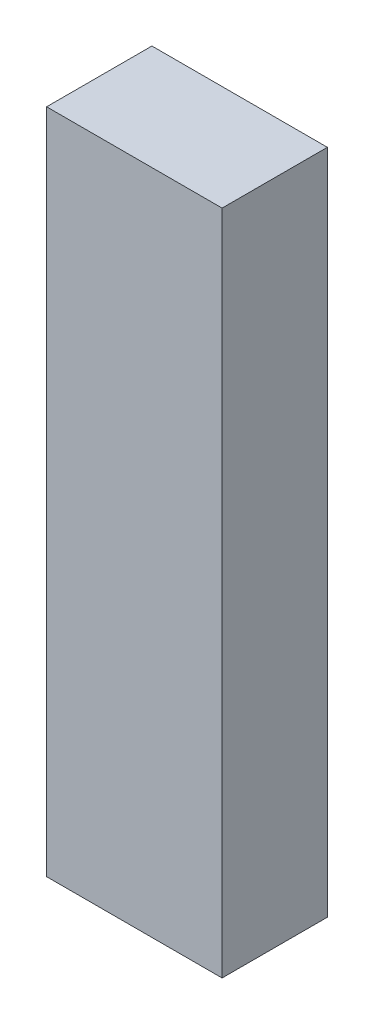
ISO-10303-21;
HEADER;
FILE_DESCRIPTION(('STEP AP214'),'2;1');
FILE_NAME('part.step','',(''),(''),'','','');
FILE_SCHEMA(('AUTOMOTIVE_DESIGN { 1 0 10303 214 1 1 1 1 }'));
ENDSEC;
DATA;
#1=APPLICATION_CONTEXT('core data for automotive mechanical design processes');
#2=APPLICATION_PROTOCOL_DEFINITION('international standard','automotive_design',2000,#1);
#3=PRODUCT_CONTEXT('',#1,'mechanical');
#4=PRODUCT('Part','Part','',(#3));
#5=PRODUCT_RELATED_PRODUCT_CATEGORY('part','',(#4));
#6=PRODUCT_DEFINITION_FORMATION('','',#4);
#7=PRODUCT_DEFINITION_CONTEXT('part definition',#1,'design');
#8=PRODUCT_DEFINITION('design','',#6,#7);
#9=PRODUCT_DEFINITION_SHAPE('','',#8);
#10=(LENGTH_UNIT() NAMED_UNIT(*) SI_UNIT(.MILLI.,.METRE.));
#11=(NAMED_UNIT(*) PLANE_ANGLE_UNIT() SI_UNIT($,.RADIAN.));
#12=(NAMED_UNIT(*) SI_UNIT($,.STERADIAN.) SOLID_ANGLE_UNIT());
#13=UNCERTAINTY_MEASURE_WITH_UNIT(LENGTH_MEASURE(1.E-05),#10,'distance_accuracy_value','');
#14=(GEOMETRIC_REPRESENTATION_CONTEXT(3) GLOBAL_UNCERTAINTY_ASSIGNED_CONTEXT((#13)) GLOBAL_UNIT_ASSIGNED_CONTEXT((#10,
#11,#12)) REPRESENTATION_CONTEXT('',''));
#15=CARTESIAN_POINT('',(0.,0.,0.));
#16=DIRECTION('',(0.,0.,1.));
#17=DIRECTION('',(1.,0.,0.));
#18=AXIS2_PLACEMENT_3D('',#15,#16,#17);
#19=CARTESIAN_POINT('',(0.497199057448997,15.6759708048161,-0.759999162582823));
#20=CARTESIAN_POINT('',(0.497199057448997,15.6759707418717,-0.0399991625828247));
#21=CARTESIAN_POINT('',(0.497199111826453,20.235970804816,-0.759998763935156));
#22=CARTESIAN_POINT('',(0.497199111826453,20.2359707418716,-0.039998763935158));
#23=(BOUNDED_SURFACE() B_SPLINE_SURFACE(1,1,((#19,#20),(#21,#22)),.UNSPECIFIED.,.F.,.F.,
.F.) B_SPLINE_SURFACE_WITH_KNOTS((2,2),(2,2),(-0.000380000000000037,0.00417999999999991),
(-0.00066,6.E-05),.UNSPECIFIED.) GEOMETRIC_REPRESENTATION_ITEM() RATIONAL_B_SPLINE_SURFACE(((1.,
1.),(1.,1.))) REPRESENTATION_ITEM('') SURFACE());
#24=CARTESIAN_POINT('',(0.497199061980452,16.0559707471171,-0.0999991293621858));
#25=CARTESIAN_POINT('',(0.497199061980452,16.0559707995707,-0.699999129362184));
#26=(BOUNDED_CURVE() B_SPLINE_CURVE(1,(#24,#25),.UNSPECIFIED.,.F.,
.F.) B_SPLINE_CURVE_WITH_KNOTS((2,2),(0.,0.0006),
.UNSPECIFIED.) CURVE() GEOMETRIC_REPRESENTATION_ITEM() RATIONAL_B_SPLINE_CURVE((1.,1.)) REPRESENTATION_ITEM(''));
#27=CARTESIAN_POINT('',(0.497199061980452,16.0559707471171,-0.0999991293621858));
#28=VERTEX_POINT('',#27);
#29=CARTESIAN_POINT('',(0.497199061980452,16.0559707995707,-0.699999129362184));
#30=VERTEX_POINT('',#29);
#31=EDGE_CURVE('E23',#28,#30,#26,.T.);
#32=CARTESIAN_POINT('',(0.497199061980452,16.0559707995707,-0.699999129362184));
#33=CARTESIAN_POINT('',(0.497199107294998,19.8559707995706,-0.699998797155795));
#34=(BOUNDED_CURVE() B_SPLINE_CURVE(1,(#32,#33),.UNSPECIFIED.,.F.,
.F.) B_SPLINE_CURVE_WITH_KNOTS((2,2),(0.,0.0037999999999999),
.UNSPECIFIED.) CURVE() GEOMETRIC_REPRESENTATION_ITEM() RATIONAL_B_SPLINE_CURVE((1.,1.)) REPRESENTATION_ITEM(''));
#35=CARTESIAN_POINT('',(0.497199107294982,19.8559707995706,-0.699998797155795));
#36=VERTEX_POINT('',#35);
#37=EDGE_CURVE('E66',#30,#36,#34,.T.);
#38=CARTESIAN_POINT('',(0.497199107294982,19.855970747117,-0.0999987971557967));
#39=CARTESIAN_POINT('',(0.497199107294982,19.8559707995706,-0.699998797155795));
#40=(BOUNDED_CURVE() B_SPLINE_CURVE(1,(#38,#39),.UNSPECIFIED.,.F.,
.F.) B_SPLINE_CURVE_WITH_KNOTS((2,2),(0.,0.0006),
.UNSPECIFIED.) CURVE() GEOMETRIC_REPRESENTATION_ITEM() RATIONAL_B_SPLINE_CURVE((1.,1.)) REPRESENTATION_ITEM(''));
#41=CARTESIAN_POINT('',(0.497199107294982,19.855970747117,-0.0999987971557967));
#42=VERTEX_POINT('',#41);
#43=EDGE_CURVE('E11',#42,#36,#40,.T.);
#44=CARTESIAN_POINT('',(0.497199061980452,16.0559707471171,-0.0999991293621858));
#45=CARTESIAN_POINT('',(0.497199107294998,19.855970747117,-0.0999987971557968));
#46=(BOUNDED_CURVE() B_SPLINE_CURVE(1,(#44,#45),.UNSPECIFIED.,.F.,
.F.) B_SPLINE_CURVE_WITH_KNOTS((2,2),(0.,0.0037999999999999),
.UNSPECIFIED.) CURVE() GEOMETRIC_REPRESENTATION_ITEM() RATIONAL_B_SPLINE_CURVE((1.,1.)) REPRESENTATION_ITEM(''));
#47=EDGE_CURVE('E64',#28,#42,#46,.T.);
#48=ORIENTED_EDGE('',*,*,#31,.T.);
#49=ORIENTED_EDGE('',*,*,#37,.T.);
#50=ORIENTED_EDGE('',*,*,#43,.F.);
#51=ORIENTED_EDGE('',*,*,#47,.F.);
#52=EDGE_LOOP('',(#48,#49,#50,#51));
#53=FACE_BOUND('',#52,.T.);
#54=ADVANCED_FACE('F17',(#53),#23,.T.);
#55=CARTESIAN_POINT('',(0.597199107294982,19.8559708036235,-0.759998797155795));
#56=CARTESIAN_POINT('',(0.597199107294982,19.8559707406791,-0.039998797155797));
#57=CARTESIAN_POINT('',(-0.602800892705019,19.8559708179334,-0.759998797155794));
#58=CARTESIAN_POINT('',(-0.602800892705019,19.855970754989,-0.0399987971557957));
#59=(BOUNDED_SURFACE() B_SPLINE_SURFACE(1,1,((#55,#56),(#57,#58)),.UNSPECIFIED.,.F.,.F.,
.F.) B_SPLINE_SURFACE_WITH_KNOTS((2,2),(2,2),(-0.0001,0.0011),(-0.00066,6.E-05),
.UNSPECIFIED.) GEOMETRIC_REPRESENTATION_ITEM() RATIONAL_B_SPLINE_SURFACE(((1.,1.),(1.,1.))) REPRESENTATION_ITEM('') SURFACE());
#60=CARTESIAN_POINT('',(0.497199107294982,19.8559707995706,-0.699998797155795));
#61=CARTESIAN_POINT('',(-0.502800892705019,19.8559708114955,-0.699998797155794));
#62=(BOUNDED_CURVE() B_SPLINE_CURVE(1,(#60,#61),.UNSPECIFIED.,.F.,
.F.) B_SPLINE_CURVE_WITH_KNOTS((2,2),(0.,0.001),
.UNSPECIFIED.) CURVE() GEOMETRIC_REPRESENTATION_ITEM() RATIONAL_B_SPLINE_CURVE((1.,1.)) REPRESENTATION_ITEM(''));
#63=CARTESIAN_POINT('',(-0.502800892705019,19.8559708114956,-0.699998797155794));
#64=VERTEX_POINT('',#63);
#65=EDGE_CURVE('E86',#36,#64,#62,.T.);
#66=CARTESIAN_POINT('',(-0.502800892705019,19.8559707590419,-0.0999987971557958));
#67=CARTESIAN_POINT('',(-0.502800892705019,19.8559708114955,-0.699998797155794));
#68=(BOUNDED_CURVE() B_SPLINE_CURVE(1,(#66,#67),.UNSPECIFIED.,.F.,
.F.) B_SPLINE_CURVE_WITH_KNOTS((2,2),(0.,0.0006),
.UNSPECIFIED.) CURVE() GEOMETRIC_REPRESENTATION_ITEM() RATIONAL_B_SPLINE_CURVE((1.,1.)) REPRESENTATION_ITEM(''));
#69=CARTESIAN_POINT('',(-0.502800892705019,19.8559707590419,-0.0999987971557958));
#70=VERTEX_POINT('',#69);
#71=EDGE_CURVE('E32',#70,#64,#68,.T.);
#72=CARTESIAN_POINT('',(0.497199107294982,19.855970747117,-0.0999987971557967));
#73=CARTESIAN_POINT('',(-0.502800892705019,19.8559707590419,-0.0999987971557957));
#74=(BOUNDED_CURVE() B_SPLINE_CURVE(1,(#72,#73),.UNSPECIFIED.,.F.,
.F.) B_SPLINE_CURVE_WITH_KNOTS((2,2),(0.,0.001),
.UNSPECIFIED.) CURVE() GEOMETRIC_REPRESENTATION_ITEM() RATIONAL_B_SPLINE_CURVE((1.,1.)) REPRESENTATION_ITEM(''));
#75=EDGE_CURVE('E71',#42,#70,#74,.T.);
#76=ORIENTED_EDGE('',*,*,#43,.T.);
#77=ORIENTED_EDGE('',*,*,#65,.T.);
#78=ORIENTED_EDGE('',*,*,#71,.F.);
#79=ORIENTED_EDGE('',*,*,#75,.F.);
#80=EDGE_LOOP('',(#76,#77,#78,#79));
#81=FACE_BOUND('',#80,.T.);
#82=ADVANCED_FACE('F72',(#81),#59,.T.);
#83=CARTESIAN_POINT('',(-0.502800888173564,20.235970816741,-0.759998763935155));
#84=CARTESIAN_POINT('',(-0.502800888173564,20.2359707537966,-0.0399987639351571));
#85=CARTESIAN_POINT('',(-0.50280094255102,15.6759708167409,-0.759999162582822));
#86=CARTESIAN_POINT('',(-0.50280094255102,15.6759707537965,-0.0399991625828237));
#87=(BOUNDED_SURFACE() B_SPLINE_SURFACE(1,1,((#83,#84),(#85,#86)),.UNSPECIFIED.,.F.,.F.,
.F.) B_SPLINE_SURFACE_WITH_KNOTS((2,2),(2,2),(-0.00038000000000007,0.00418),(-0.00066,6.E-05),
.UNSPECIFIED.) GEOMETRIC_REPRESENTATION_ITEM() RATIONAL_B_SPLINE_SURFACE(((1.,1.),(1.,1.))) REPRESENTATION_ITEM('') SURFACE());
#88=CARTESIAN_POINT('',(-0.502800892705019,19.8559708114956,-0.699998797155794));
#89=CARTESIAN_POINT('',(-0.502800938019565,16.0559708114956,-0.699999129362183));
#90=(BOUNDED_CURVE() B_SPLINE_CURVE(1,(#88,#89),.UNSPECIFIED.,.F.,
.F.) B_SPLINE_CURVE_WITH_KNOTS((2,2),(0.,0.0038),
.UNSPECIFIED.) CURVE() GEOMETRIC_REPRESENTATION_ITEM() RATIONAL_B_SPLINE_CURVE((1.,1.)) REPRESENTATION_ITEM(''));
#91=CARTESIAN_POINT('',(-0.502800938019549,16.0559708114956,-0.699999129362183));
#92=VERTEX_POINT('',#91);
#93=EDGE_CURVE('E124',#64,#92,#90,.T.);
#94=CARTESIAN_POINT('',(-0.502800938019549,16.0559707590419,-0.0999991293621849));
#95=CARTESIAN_POINT('',(-0.502800938019549,16.0559708114955,-0.699999129362183));
#96=(BOUNDED_CURVE() B_SPLINE_CURVE(1,(#94,#95),.UNSPECIFIED.,.F.,
.F.) B_SPLINE_CURVE_WITH_KNOTS((2,2),(0.,0.0006),
.UNSPECIFIED.) CURVE() GEOMETRIC_REPRESENTATION_ITEM() RATIONAL_B_SPLINE_CURVE((1.,1.)) REPRESENTATION_ITEM(''));
#97=CARTESIAN_POINT('',(-0.502800938019549,16.0559707590419,-0.0999991293621849));
#98=VERTEX_POINT('',#97);
#99=EDGE_CURVE('E41',#98,#92,#96,.T.);
#100=CARTESIAN_POINT('',(-0.502800892705019,19.8559707590419,-0.0999987971557958));
#101=CARTESIAN_POINT('',(-0.502800938019565,16.0559707590419,-0.0999991293621848));
#102=(BOUNDED_CURVE() B_SPLINE_CURVE(1,(#100,#101),.UNSPECIFIED.,.F.,
.F.) B_SPLINE_CURVE_WITH_KNOTS((2,2),(0.,0.0038),
.UNSPECIFIED.) CURVE() GEOMETRIC_REPRESENTATION_ITEM() RATIONAL_B_SPLINE_CURVE((1.,1.)) REPRESENTATION_ITEM(''));
#103=EDGE_CURVE('E77',#70,#98,#102,.T.);
#104=ORIENTED_EDGE('',*,*,#71,.T.);
#105=ORIENTED_EDGE('',*,*,#93,.T.);
#106=ORIENTED_EDGE('',*,*,#99,.F.);
#107=ORIENTED_EDGE('',*,*,#103,.F.);
#108=EDGE_LOOP('',(#104,#105,#106,#107));
#109=FACE_BOUND('',#108,.T.);
#110=ADVANCED_FACE('F187',(#109),#87,.T.);
#111=CARTESIAN_POINT('',(-0.602800938019549,16.0559708179334,-0.759999129362183));
#112=CARTESIAN_POINT('',(-0.602800938019549,16.055970754989,-0.0399991293621848));
#113=CARTESIAN_POINT('',(0.597199061980452,16.0559708036235,-0.759999129362184));
#114=CARTESIAN_POINT('',(0.597199061980452,16.0559707406792,-0.0399991293621861));
#115=(BOUNDED_SURFACE() B_SPLINE_SURFACE(1,1,((#111,#112),(#113,#114)),.UNSPECIFIED.,.F.,.F.,
.F.) B_SPLINE_SURFACE_WITH_KNOTS((2,2),(2,2),(-0.0001,0.0011),(-0.00066,6.E-05),
.UNSPECIFIED.) GEOMETRIC_REPRESENTATION_ITEM() RATIONAL_B_SPLINE_SURFACE(((1.,1.),(1.,1.))) REPRESENTATION_ITEM('') SURFACE());
#116=CARTESIAN_POINT('',(-0.502800938019549,16.0559708114956,-0.699999129362183));
#117=CARTESIAN_POINT('',(0.497199061980452,16.0559707995707,-0.699999129362184));
#118=(BOUNDED_CURVE() B_SPLINE_CURVE(1,(#116,#117),.UNSPECIFIED.,.F.,
.F.) B_SPLINE_CURVE_WITH_KNOTS((2,2),(0.,0.001),
.UNSPECIFIED.) CURVE() GEOMETRIC_REPRESENTATION_ITEM() RATIONAL_B_SPLINE_CURVE((1.,1.)) REPRESENTATION_ITEM(''));
#119=EDGE_CURVE('E142',#92,#30,#118,.T.);
#120=CARTESIAN_POINT('',(-0.502800938019549,16.0559707590419,-0.0999991293621849));
#121=CARTESIAN_POINT('',(0.497199061980452,16.055970747117,-0.0999991293621859));
#122=(BOUNDED_CURVE() B_SPLINE_CURVE(1,(#120,#121),.UNSPECIFIED.,.F.,
.F.) B_SPLINE_CURVE_WITH_KNOTS((2,2),(0.,0.001),
.UNSPECIFIED.) CURVE() GEOMETRIC_REPRESENTATION_ITEM() RATIONAL_B_SPLINE_CURVE((1.,1.)) REPRESENTATION_ITEM(''));
#123=EDGE_CURVE('E79',#98,#28,#122,.T.);
#124=ORIENTED_EDGE('',*,*,#99,.T.);
#125=ORIENTED_EDGE('',*,*,#119,.T.);
#126=ORIENTED_EDGE('',*,*,#31,.F.);
#127=ORIENTED_EDGE('',*,*,#123,.F.);
#128=EDGE_LOOP('',(#124,#125,#126,#127));
#129=FACE_BOUND('',#128,.T.);
#130=ADVANCED_FACE('F166',(#129),#115,.T.);
#131=CARTESIAN_POINT('',(-0.602800888173566,20.2359707602344,-0.0999987639351568));
#132=CARTESIAN_POINT('',(0.597199111826455,20.2359707459245,-0.099998763935158));
#133=CARTESIAN_POINT('',(-0.602800942551022,15.6759707602344,-0.0999991625828236));
#134=CARTESIAN_POINT('',(0.597199057448999,15.6759707459245,-0.0999991625828248));
#135=(BOUNDED_SURFACE() B_SPLINE_SURFACE(1,1,((#131,#132),(#133,#134)),.UNSPECIFIED.,.F.,.F.,
.F.) B_SPLINE_SURFACE_WITH_KNOTS((2,2),(2,2),(-0.00227999999999997,0.00228000000000005),
(-0.000600000000000011,0.00060000000000001),
.UNSPECIFIED.) GEOMETRIC_REPRESENTATION_ITEM() RATIONAL_B_SPLINE_SURFACE(((1.,1.),(1.,1.))) REPRESENTATION_ITEM('') SURFACE());
#136=ORIENTED_EDGE('',*,*,#47,.T.);
#137=ORIENTED_EDGE('',*,*,#75,.T.);
#138=ORIENTED_EDGE('',*,*,#103,.T.);
#139=ORIENTED_EDGE('',*,*,#123,.T.);
#140=EDGE_LOOP('',(#136,#137,#138,#139));
#141=FACE_BOUND('',#140,.T.);
#142=ADVANCED_FACE('F19',(#141),#135,.T.);
#143=CARTESIAN_POINT('',(-0.602800942551022,15.6759708126881,-0.699999162582822));
#144=CARTESIAN_POINT('',(0.597199057448999,15.6759707983782,-0.699999162582823));
#145=CARTESIAN_POINT('',(-0.602800888173566,20.2359708126881,-0.699998763935155));
#146=CARTESIAN_POINT('',(0.597199111826455,20.2359707983782,-0.699998763935156));
#147=(BOUNDED_SURFACE() B_SPLINE_SURFACE(1,1,((#143,#144),(#145,#146)),.UNSPECIFIED.,.F.,.F.,
.F.) B_SPLINE_SURFACE_WITH_KNOTS((2,2),(2,2),(-0.00228000000000007,0.00227999999999997),
(-0.000600000000000011,0.00060000000000001),
.UNSPECIFIED.) GEOMETRIC_REPRESENTATION_ITEM() RATIONAL_B_SPLINE_SURFACE(((1.,1.),(1.,1.))) REPRESENTATION_ITEM('') SURFACE());
#148=ORIENTED_EDGE('',*,*,#119,.F.);
#149=ORIENTED_EDGE('',*,*,#93,.F.);
#150=ORIENTED_EDGE('',*,*,#65,.F.);
#151=ORIENTED_EDGE('',*,*,#37,.F.);
#152=EDGE_LOOP('',(#148,#149,#150,#151));
#153=FACE_BOUND('',#152,.T.);
#154=ADVANCED_FACE('F168',(#153),#147,.T.);
#155=CLOSED_SHELL('',(#54,#82,#110,#130,#142,#154));
#156=MANIFOLD_SOLID_BREP('B1',#155);
#157=ADVANCED_BREP_SHAPE_REPRESENTATION('',(#18,#156),#14);
#158=SHAPE_DEFINITION_REPRESENTATION(#9,#157);
ENDSEC;
END-ISO-10303-21;
